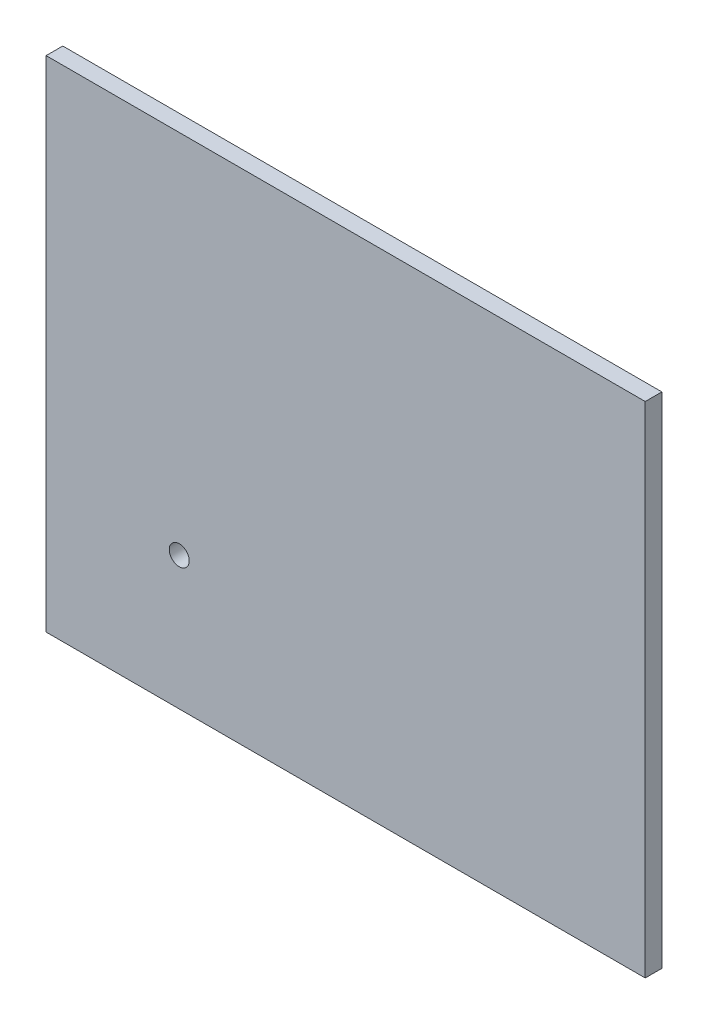
ISO-10303-21;
HEADER;
FILE_DESCRIPTION(('STEP AP214'),'2;1');
FILE_NAME('part.step','',(''),(''),'','','');
FILE_SCHEMA(('AUTOMOTIVE_DESIGN { 1 0 10303 214 1 1 1 1 }'));
ENDSEC;
DATA;
#1=APPLICATION_CONTEXT('core data for automotive mechanical design processes');
#2=APPLICATION_PROTOCOL_DEFINITION('international standard','automotive_design',2000,#1);
#3=PRODUCT_CONTEXT('',#1,'mechanical');
#4=PRODUCT('Part','Part','',(#3));
#5=PRODUCT_RELATED_PRODUCT_CATEGORY('part','',(#4));
#6=PRODUCT_DEFINITION_FORMATION('','',#4);
#7=PRODUCT_DEFINITION_CONTEXT('part definition',#1,'design');
#8=PRODUCT_DEFINITION('design','',#6,#7);
#9=PRODUCT_DEFINITION_SHAPE('','',#8);
#10=(LENGTH_UNIT() NAMED_UNIT(*) SI_UNIT(.MILLI.,.METRE.));
#11=(NAMED_UNIT(*) PLANE_ANGLE_UNIT() SI_UNIT($,.RADIAN.));
#12=(NAMED_UNIT(*) SI_UNIT($,.STERADIAN.) SOLID_ANGLE_UNIT());
#13=UNCERTAINTY_MEASURE_WITH_UNIT(LENGTH_MEASURE(1.E-05),#10,'distance_accuracy_value','');
#14=(GEOMETRIC_REPRESENTATION_CONTEXT(3) GLOBAL_UNCERTAINTY_ASSIGNED_CONTEXT((#13)) GLOBAL_UNIT_ASSIGNED_CONTEXT((#10,
#11,#12)) REPRESENTATION_CONTEXT('',''));
#15=CARTESIAN_POINT('',(0.,0.,0.));
#16=DIRECTION('',(0.,0.,1.));
#17=DIRECTION('',(1.,0.,0.));
#18=AXIS2_PLACEMENT_3D('',#15,#16,#17);
#19=CARTESIAN_POINT('',(0.,0.,5.));
#20=DIRECTION('',(0.,0.,1.));
#21=DIRECTION('',(1.,0.,0.));
#22=AXIS2_PLACEMENT_3D('',#19,#20,#21);
#23=PLANE('',#22);
#24=DIRECTION('',(0.,-1.,0.));
#25=VECTOR('',#24,1.);
#26=CARTESIAN_POINT('',(-90.,-75.,5.));
#27=LINE('',#26,#25);
#28=CARTESIAN_POINT('',(-90.,75.,5.));
#29=VERTEX_POINT('',#28);
#30=CARTESIAN_POINT('',(-90.,-75.,5.));
#31=VERTEX_POINT('',#30);
#32=EDGE_CURVE('E85',#29,#31,#27,.T.);
#33=ORIENTED_EDGE('',*,*,#32,.T.);
#34=DIRECTION('',(1.,0.,0.));
#35=VECTOR('',#34,1.);
#36=CARTESIAN_POINT('',(90.,-75.,5.));
#37=LINE('',#36,#35);
#38=CARTESIAN_POINT('',(90.,-75.,5.));
#39=VERTEX_POINT('',#38);
#40=EDGE_CURVE('E80',#31,#39,#37,.T.);
#41=ORIENTED_EDGE('',*,*,#40,.T.);
#42=DIRECTION('',(0.,1.,0.));
#43=VECTOR('',#42,1.);
#44=CARTESIAN_POINT('',(90.,-75.,5.));
#45=LINE('',#44,#43);
#46=CARTESIAN_POINT('',(90.,75.,5.));
#47=VERTEX_POINT('',#46);
#48=EDGE_CURVE('E83',#39,#47,#45,.T.);
#49=ORIENTED_EDGE('',*,*,#48,.T.);
#50=DIRECTION('',(-1.,0.,0.));
#51=VECTOR('',#50,1.);
#52=CARTESIAN_POINT('',(90.,75.,5.));
#53=LINE('',#52,#51);
#54=EDGE_CURVE('E50',#47,#29,#53,.T.);
#55=ORIENTED_EDGE('',*,*,#54,.T.);
#56=EDGE_LOOP('',(#33,#41,#49,#55));
#57=FACE_BOUND('',#56,.T.);
#58=CARTESIAN_POINT('',(-50.,-35.,5.));
#59=DIRECTION('',(0.,0.,1.));
#60=DIRECTION('',(1.,0.,0.));
#61=AXIS2_PLACEMENT_3D('',#58,#59,#60);
#62=CIRCLE('',#61,3.);
#63=CARTESIAN_POINT('',(-47.,-35.,5.));
#64=VERTEX_POINT('',#63);
#65=EDGE_CURVE('E100',#64,#64,#62,.T.);
#66=ORIENTED_EDGE('',*,*,#65,.F.);
#67=EDGE_LOOP('',(#66));
#68=FACE_BOUND('',#67,.T.);
#69=ADVANCED_FACE('F33',(#57,#68),#23,.T.);
#70=CARTESIAN_POINT('',(0.,0.,0.));
#71=DIRECTION('',(0.,0.,1.));
#72=DIRECTION('',(1.,0.,0.));
#73=AXIS2_PLACEMENT_3D('',#70,#71,#72);
#74=PLANE('',#73);
#75=DIRECTION('',(0.,-1.,0.));
#76=VECTOR('',#75,1.);
#77=CARTESIAN_POINT('',(-90.,-75.,0.));
#78=LINE('',#77,#76);
#79=CARTESIAN_POINT('',(-90.,75.,0.));
#80=VERTEX_POINT('',#79);
#81=CARTESIAN_POINT('',(-90.,-75.,0.));
#82=VERTEX_POINT('',#81);
#83=EDGE_CURVE('E97',#80,#82,#78,.T.);
#84=ORIENTED_EDGE('',*,*,#83,.F.);
#85=DIRECTION('',(-1.,0.,0.));
#86=VECTOR('',#85,1.);
#87=CARTESIAN_POINT('',(90.,75.,0.));
#88=LINE('',#87,#86);
#89=CARTESIAN_POINT('',(90.,75.,0.));
#90=VERTEX_POINT('',#89);
#91=EDGE_CURVE('E73',#90,#80,#88,.T.);
#92=ORIENTED_EDGE('',*,*,#91,.F.);
#93=DIRECTION('',(0.,1.,0.));
#94=VECTOR('',#93,1.);
#95=CARTESIAN_POINT('',(90.,-75.,0.));
#96=LINE('',#95,#94);
#97=CARTESIAN_POINT('',(90.,-75.,0.));
#98=VERTEX_POINT('',#97);
#99=EDGE_CURVE('E67',#98,#90,#96,.T.);
#100=ORIENTED_EDGE('',*,*,#99,.F.);
#101=DIRECTION('',(1.,0.,0.));
#102=VECTOR('',#101,1.);
#103=CARTESIAN_POINT('',(90.,-75.,0.));
#104=LINE('',#103,#102);
#105=EDGE_CURVE('E89',#82,#98,#104,.T.);
#106=ORIENTED_EDGE('',*,*,#105,.F.);
#107=EDGE_LOOP('',(#84,#92,#100,#106));
#108=FACE_BOUND('',#107,.T.);
#109=CARTESIAN_POINT('',(-50.,-35.,0.));
#110=DIRECTION('',(0.,0.,1.));
#111=DIRECTION('',(1.,0.,0.));
#112=AXIS2_PLACEMENT_3D('',#109,#110,#111);
#113=CIRCLE('',#112,3.);
#114=CARTESIAN_POINT('',(-47.,-35.,0.));
#115=VERTEX_POINT('',#114);
#116=EDGE_CURVE('E112',#115,#115,#113,.T.);
#117=ORIENTED_EDGE('',*,*,#116,.T.);
#118=EDGE_LOOP('',(#117));
#119=FACE_BOUND('',#118,.T.);
#120=ADVANCED_FACE('F108',(#108,#119),#74,.F.);
#121=CARTESIAN_POINT('',(-90.,-75.,5.));
#122=DIRECTION('',(1.,0.,0.));
#123=DIRECTION('',(0.,0.,-1.));
#124=AXIS2_PLACEMENT_3D('',#121,#122,#123);
#125=PLANE('',#124);
#126=ORIENTED_EDGE('',*,*,#83,.T.);
#127=DIRECTION('',(0.,0.,-1.));
#128=VECTOR('',#127,1.);
#129=CARTESIAN_POINT('',(-90.,-75.,5.));
#130=LINE('',#129,#128);
#131=EDGE_CURVE('E11',#31,#82,#130,.T.);
#132=ORIENTED_EDGE('',*,*,#131,.F.);
#133=ORIENTED_EDGE('',*,*,#32,.F.);
#134=DIRECTION('',(0.,0.,-1.));
#135=VECTOR('',#134,1.);
#136=CARTESIAN_POINT('',(-90.,75.,5.));
#137=LINE('',#136,#135);
#138=EDGE_CURVE('E93',#29,#80,#137,.T.);
#139=ORIENTED_EDGE('',*,*,#138,.T.);
#140=EDGE_LOOP('',(#126,#132,#133,#139));
#141=FACE_BOUND('',#140,.T.);
#142=ADVANCED_FACE('F35',(#141),#125,.F.);
#143=CARTESIAN_POINT('',(90.,-75.,5.));
#144=DIRECTION('',(0.,1.,0.));
#145=DIRECTION('',(-1.,0.,0.));
#146=AXIS2_PLACEMENT_3D('',#143,#144,#145);
#147=PLANE('',#146);
#148=ORIENTED_EDGE('',*,*,#105,.T.);
#149=DIRECTION('',(0.,0.,-1.));
#150=VECTOR('',#149,1.);
#151=CARTESIAN_POINT('',(90.,-75.,5.));
#152=LINE('',#151,#150);
#153=EDGE_CURVE('E42',#39,#98,#152,.T.);
#154=ORIENTED_EDGE('',*,*,#153,.F.);
#155=ORIENTED_EDGE('',*,*,#40,.F.);
#156=ORIENTED_EDGE('',*,*,#131,.T.);
#157=EDGE_LOOP('',(#148,#154,#155,#156));
#158=FACE_BOUND('',#157,.T.);
#159=ADVANCED_FACE('F88',(#158),#147,.F.);
#160=CARTESIAN_POINT('',(90.,-75.,5.));
#161=DIRECTION('',(-1.,0.,0.));
#162=DIRECTION('',(0.,0.,1.));
#163=AXIS2_PLACEMENT_3D('',#160,#161,#162);
#164=PLANE('',#163);
#165=ORIENTED_EDGE('',*,*,#99,.T.);
#166=DIRECTION('',(0.,0.,-1.));
#167=VECTOR('',#166,1.);
#168=CARTESIAN_POINT('',(90.,75.,5.));
#169=LINE('',#168,#167);
#170=EDGE_CURVE('E90',#47,#90,#169,.T.);
#171=ORIENTED_EDGE('',*,*,#170,.F.);
#172=ORIENTED_EDGE('',*,*,#48,.F.);
#173=ORIENTED_EDGE('',*,*,#153,.T.);
#174=EDGE_LOOP('',(#165,#171,#172,#173));
#175=FACE_BOUND('',#174,.T.);
#176=ADVANCED_FACE('F91',(#175),#164,.F.);
#177=CARTESIAN_POINT('',(90.,75.,5.));
#178=DIRECTION('',(0.,-1.,0.));
#179=DIRECTION('',(1.,0.,0.));
#180=AXIS2_PLACEMENT_3D('',#177,#178,#179);
#181=PLANE('',#180);
#182=ORIENTED_EDGE('',*,*,#91,.T.);
#183=ORIENTED_EDGE('',*,*,#138,.F.);
#184=ORIENTED_EDGE('',*,*,#54,.F.);
#185=ORIENTED_EDGE('',*,*,#170,.T.);
#186=EDGE_LOOP('',(#182,#183,#184,#185));
#187=FACE_BOUND('',#186,.T.);
#188=ADVANCED_FACE('F105',(#187),#181,.F.);
#189=CARTESIAN_POINT('',(-50.,-35.,5.));
#190=DIRECTION('',(0.,0.,-1.));
#191=DIRECTION('',(-1.,0.,0.));
#192=AXIS2_PLACEMENT_3D('',#189,#190,#191);
#193=CYLINDRICAL_SURFACE('',#192,3.);
#194=ORIENTED_EDGE('',*,*,#65,.T.);
#195=EDGE_LOOP('',(#194));
#196=FACE_BOUND('',#195,.T.);
#197=ORIENTED_EDGE('',*,*,#116,.F.);
#198=EDGE_LOOP('',(#197));
#199=FACE_BOUND('',#198,.T.);
#200=ADVANCED_FACE('F118',(#196,#199),#193,.F.);
#201=CLOSED_SHELL('',(#69,#120,#142,#159,#176,#188,#200));
#202=MANIFOLD_SOLID_BREP('B2',#201);
#203=ADVANCED_BREP_SHAPE_REPRESENTATION('',(#18,#202),#14);
#204=SHAPE_DEFINITION_REPRESENTATION(#9,#203);
ENDSEC;
END-ISO-10303-21;
